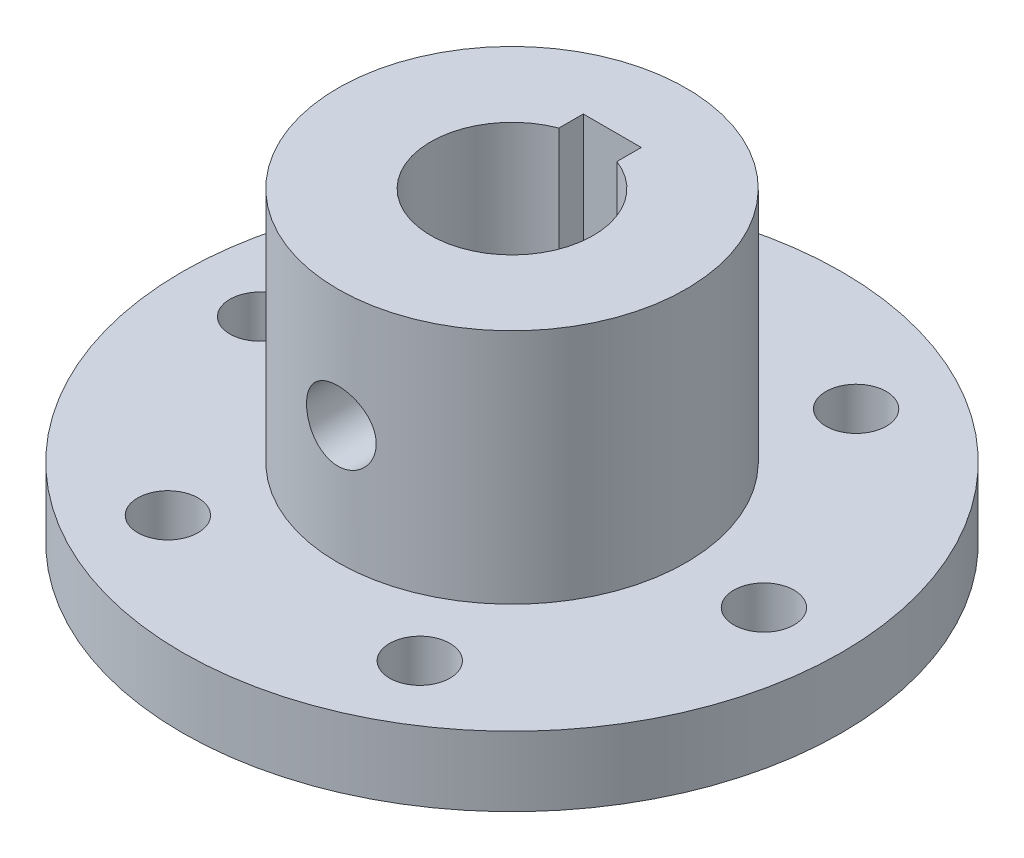
ISO-10303-21;
HEADER;
FILE_DESCRIPTION(('STEP AP214'),'2;1');
FILE_NAME('part.step','',(''),(''),'','','');
FILE_SCHEMA(('AUTOMOTIVE_DESIGN { 1 0 10303 214 1 1 1 1 }'));
ENDSEC;
DATA;
#1=APPLICATION_CONTEXT('core data for automotive mechanical design processes');
#2=APPLICATION_PROTOCOL_DEFINITION('international standard','automotive_design',2000,#1);
#3=PRODUCT_CONTEXT('',#1,'mechanical');
#4=PRODUCT('Part','Part','',(#3));
#5=PRODUCT_RELATED_PRODUCT_CATEGORY('part','',(#4));
#6=PRODUCT_DEFINITION_FORMATION('','',#4);
#7=PRODUCT_DEFINITION_CONTEXT('part definition',#1,'design');
#8=PRODUCT_DEFINITION('design','',#6,#7);
#9=PRODUCT_DEFINITION_SHAPE('','',#8);
#10=(LENGTH_UNIT() NAMED_UNIT(*) SI_UNIT(.MILLI.,.METRE.));
#11=(NAMED_UNIT(*) PLANE_ANGLE_UNIT() SI_UNIT($,.RADIAN.));
#12=(NAMED_UNIT(*) SI_UNIT($,.STERADIAN.) SOLID_ANGLE_UNIT());
#13=UNCERTAINTY_MEASURE_WITH_UNIT(LENGTH_MEASURE(1.E-05),#10,'distance_accuracy_value','');
#14=(GEOMETRIC_REPRESENTATION_CONTEXT(3) GLOBAL_UNCERTAINTY_ASSIGNED_CONTEXT((#13)) GLOBAL_UNIT_ASSIGNED_CONTEXT((#10,
#11,#12)) REPRESENTATION_CONTEXT('',''));
#15=CARTESIAN_POINT('',(0.,0.,0.));
#16=DIRECTION('',(0.,0.,1.));
#17=DIRECTION('',(1.,0.,0.));
#18=AXIS2_PLACEMENT_3D('',#15,#16,#17);
#19=CARTESIAN_POINT('',(0.,26.4,0.));
#20=DIRECTION('',(0.,-1.,0.));
#21=DIRECTION('',(0.,0.,-1.));
#22=AXIS2_PLACEMENT_3D('',#19,#20,#21);
#23=CYLINDRICAL_SURFACE('',#22,15.);
#24=CARTESIAN_POINT('',(0.,26.4,0.));
#25=DIRECTION('',(0.,1.,0.));
#26=DIRECTION('',(0.,0.,1.));
#27=AXIS2_PLACEMENT_3D('',#24,#25,#26);
#28=CIRCLE('',#27,15.);
#29=CARTESIAN_POINT('',(0.,26.4,15.));
#30=VERTEX_POINT('',#29);
#31=EDGE_CURVE('E145',#30,#30,#28,.T.);
#32=ORIENTED_EDGE('',*,*,#31,.F.);
#33=EDGE_LOOP('',(#32));
#34=FACE_BOUND('',#33,.T.);
#35=CARTESIAN_POINT('',(0.,6.,0.));
#36=DIRECTION('',(0.,1.,0.));
#37=DIRECTION('',(0.,0.,1.));
#38=AXIS2_PLACEMENT_3D('',#35,#36,#37);
#39=CIRCLE('',#38,15.);
#40=CARTESIAN_POINT('',(0.,6.,15.));
#41=VERTEX_POINT('',#40);
#42=EDGE_CURVE('E12',#41,#41,#39,.T.);
#43=ORIENTED_EDGE('',*,*,#42,.T.);
#44=EDGE_LOOP('',(#43));
#45=FACE_BOUND('',#44,.T.);
#46=CARTESIAN_POINT('',(-3.,16.2,14.6969384566991));
#47=CARTESIAN_POINT('',(-2.99999383762581,16.0333068735265,14.6969417707994));
#48=CARTESIAN_POINT('',(-2.98605951515443,15.86653613,14.6998052480611));
#49=CARTESIAN_POINT('',(-2.93073685074852,15.5377124845706,14.7109329391462));
#50=CARTESIAN_POINT('',(-2.88932654121148,15.3756634660921,14.7192014743436));
#51=CARTESIAN_POINT('',(-2.78038734785924,15.0610880899374,14.7401662116556));
#52=CARTESIAN_POINT('',(-2.71288444245786,14.9085524354022,14.7528580086323));
#53=CARTESIAN_POINT('',(-2.55374732301151,14.6169754659091,14.7812339844198));
#54=CARTESIAN_POINT('',(-2.46211445580345,14.4779333983863,14.7969179962038));
#55=CARTESIAN_POINT('',(-2.25593722696031,14.2153169884384,14.8297589908276));
#56=CARTESIAN_POINT('',(-2.14111696773995,14.0919612363481,14.8469321351174));
#57=CARTESIAN_POINT('',(-1.89242036706393,13.8661273992631,14.880674169078));
#58=CARTESIAN_POINT('',(-1.75854269093395,13.7636507777484,14.8972430163249));
#59=CARTESIAN_POINT('',(-1.47408406777277,13.5816359471146,14.9280838925269));
#60=CARTESIAN_POINT('',(-1.32336770301663,13.5023054585501,14.9423346432465));
#61=CARTESIAN_POINT('',(-1.01041245116181,13.3701751888556,14.9667521065089));
#62=CARTESIAN_POINT('',(-0.848174644261657,13.317372924297,14.9769192013236));
#63=CARTESIAN_POINT('',(-0.519050319835482,13.2404784191411,14.9919096206526));
#64=CARTESIAN_POINT('',(-0.352253217644441,13.216017067287,14.9968015886438));
#65=CARTESIAN_POINT('',(-0.0168557053126079,13.1953471444851,15.0009276355081));
#66=CARTESIAN_POINT('',(0.15174452949553,13.1991358510625,15.0001622595828));
#67=CARTESIAN_POINT('',(0.483426002230767,13.2345785406467,14.9931130460555));
#68=CARTESIAN_POINT('',(0.646551642895411,13.2658349315035,14.9869079509751));
#69=CARTESIAN_POINT('',(0.965194879740904,13.3546950973767,14.9697653147823));
#70=CARTESIAN_POINT('',(1.12071217124139,13.4122999265756,14.9588275843212));
#71=CARTESIAN_POINT('',(1.42085838960266,13.5525901204418,14.9333188805988));
#72=CARTESIAN_POINT('',(1.5654125224017,13.6354312533147,14.9187254452567));
#73=CARTESIAN_POINT('',(1.83871513757927,13.8237272317098,14.8875140842136));
#74=CARTESIAN_POINT('',(1.967461798575,13.9291846793115,14.8708959256567));
#75=CARTESIAN_POINT('',(2.20785429316037,14.1619008663254,14.8371289309338));
#76=CARTESIAN_POINT('',(2.31916294972089,14.2895075601888,14.8199758937255));
#77=CARTESIAN_POINT('',(2.51885547953042,14.5617493273523,14.7873471479628));
#78=CARTESIAN_POINT('',(2.60723891918325,14.7063847226496,14.7718714711364));
#79=CARTESIAN_POINT('',(2.75868844440565,15.0090624954654,14.7443414241877));
#80=CARTESIAN_POINT('',(2.82169994333313,15.167132902919,14.7322944469065));
#81=CARTESIAN_POINT('',(2.92017102488275,15.491913971172,14.7130942896382));
#82=CARTESIAN_POINT('',(2.95563419836993,15.6586235028573,14.7059404718528));
#83=CARTESIAN_POINT('',(2.99749801810815,15.9928945739971,14.6974643780348));
#84=CARTESIAN_POINT('',(3.00438557669374,16.160392722931,14.6960444117146));
#85=CARTESIAN_POINT('',(2.99021288493222,16.494144669599,14.6989345706656));
#86=CARTESIAN_POINT('',(2.96915421936733,16.6603985373566,14.7032443710116));
#87=CARTESIAN_POINT('',(2.90010662422247,16.9853059208767,14.7170169748474));
#88=CARTESIAN_POINT('',(2.8523778625179,17.1440170291073,14.7264299704349));
#89=CARTESIAN_POINT('',(2.73162310592555,17.4511898370862,14.7493046805499));
#90=CARTESIAN_POINT('',(2.65859502711953,17.5996506913072,14.7627667285881));
#91=CARTESIAN_POINT('',(2.48821242664679,17.8842393298505,14.7924421788612));
#92=CARTESIAN_POINT('',(2.39055323394826,18.0201811389025,14.8086891559471));
#93=CARTESIAN_POINT('',(2.17408671663814,18.2739249360027,14.8420117147991));
#94=CARTESIAN_POINT('',(2.05527721543361,18.3917250547478,14.8590873817145));
#95=CARTESIAN_POINT('',(1.79769682049367,18.6076876775567,14.8924603760765));
#96=CARTESIAN_POINT('',(1.65864749678889,18.70552096395,14.9087417312605));
#97=CARTESIAN_POINT('',(1.36580368990427,18.8764376444988,14.9384138288586));
#98=CARTESIAN_POINT('',(1.21200982630052,18.9495220780343,14.9518046926563));
#99=CARTESIAN_POINT('',(0.894908042472041,19.0683866152399,14.974118821832));
#100=CARTESIAN_POINT('',(0.731660020434237,19.1143215546788,14.9830673742781));
#101=CARTESIAN_POINT('',(0.399568364039736,19.1780737429915,14.9955970781298));
#102=CARTESIAN_POINT('',(0.230725406133636,19.195894378427,14.9991788759955));
#103=CARTESIAN_POINT('',(-0.104618681710863,19.2027809428887,15.0005562136234));
#104=CARTESIAN_POINT('',(-0.271109436424482,19.1923418413687,14.9984513564799));
#105=CARTESIAN_POINT('',(-0.599913093946949,19.1440981483565,14.9889013068102));
#106=CARTESIAN_POINT('',(-0.762226049261166,19.1062939009556,14.9814561814329));
#107=CARTESIAN_POINT('',(-1.07775824923519,19.0046130237252,14.9620649509476));
#108=CARTESIAN_POINT('',(-1.23099732972049,18.9407958656071,14.9501291174284));
#109=CARTESIAN_POINT('',(-1.52466366055821,18.7889632760067,14.9230416637104));
#110=CARTESIAN_POINT('',(-1.66508989730354,18.7009459322865,14.9078897894096));
#111=CARTESIAN_POINT('',(-1.93159167031775,18.5015418388161,14.8757279747022));
#112=CARTESIAN_POINT('',(-2.05739914834453,18.3898009908487,14.858692002537));
#113=CARTESIAN_POINT('',(-2.28864785327552,18.1468492797037,14.8248366872359));
#114=CARTESIAN_POINT('',(-2.39408424962674,18.0156338115602,14.8080173963616));
#115=CARTESIAN_POINT('',(-2.58267665834994,17.7357620499287,14.7763002820179));
#116=CARTESIAN_POINT('',(-2.66558044385427,17.5869331166362,14.7614251071368));
#117=CARTESIAN_POINT('',(-2.80507214779868,17.2772016802197,14.7355571137924));
#118=CARTESIAN_POINT('',(-2.86168393792249,17.1163102839384,14.7245607757495));
#119=CARTESIAN_POINT('',(-2.93600741957297,16.8292126336714,14.7098904341354));
#120=CARTESIAN_POINT('',(-2.95996169557105,16.7046437414581,14.7050635474382));
#121=CARTESIAN_POINT('',(-2.99196005387913,16.4533981363466,14.6985863537725));
#122=CARTESIAN_POINT('',(-3.00000468468793,16.3267214962666,14.6969359372925));
#123=CARTESIAN_POINT('',(-3.,16.2,14.6969384566991));
#124=B_SPLINE_CURVE_WITH_KNOTS('',3,(#46,#47,#48,#49,#50,#51,#52,#53,#54,#55,#56,#57,#58,#59,
#60,#61,#62,#63,#64,#65,#66,#67,#68,#69,#70,#71,#72,#73,#74,#75,#76,#77,#78,#79,#80,#81,#82,#83,
#84,#85,#86,#87,#88,#89,#90,#91,#92,#93,#94,#95,#96,#97,#98,#99,#100,#101,#102,#103,#104,#105,
#106,#107,#108,#109,#110,#111,#112,#113,#114,#115,#116,#117,#118,#119,#120,#121,#122,#123),
.UNSPECIFIED.,.T.,.F.,(4,2,2,2,2,2,2,2,2,2,2,2,2,2,2,2,2,2,2,2,2,2,2,2,2,2,2,2,2,2,2,2,2,2,2,2,
2,2,4),(0.,0.499615391608283,0.999630717852891,1.49914949382176,1.99864039457959,
2.50446757645311,3.01033020106266,3.52060201312351,4.03082604739679,4.53432746649241,
5.03778036348745,5.53406368900613,6.03036687221251,6.5297977266691,7.02928607310198,
7.5374804028745,8.04568434368161,8.5549758951833,9.06420105048074,9.5647127341378,
10.0651960358526,10.5608802534996,11.056605310632,11.5587917932356,12.0610299861063,
12.5709780520035,13.0809046989031,13.5878944073595,14.0948230407488,14.5929305224406,
15.0910317410027,15.5880005122636,16.0850085640405,16.5900345607679,17.0951801666934,
17.6057669573882,18.1158892527059,18.4957141091448,18.8755258705644),.UNSPECIFIED.);
#125=CARTESIAN_POINT('',(-3.,16.2,14.6969384566991));
#126=VERTEX_POINT('',#125);
#127=EDGE_CURVE('E129',#126,#126,#124,.T.);
#128=ORIENTED_EDGE('',*,*,#127,.F.);
#129=EDGE_LOOP('',(#128));
#130=FACE_BOUND('',#129,.T.);
#131=ADVANCED_FACE('F56',(#34,#45,#130),#23,.T.);
#132=CARTESIAN_POINT('',(0.,0.,0.));
#133=DIRECTION('',(0.,1.,0.));
#134=DIRECTION('',(0.,0.,1.));
#135=AXIS2_PLACEMENT_3D('',#132,#133,#134);
#136=CYLINDRICAL_SURFACE('',#135,7.);
#137=CARTESIAN_POINT('',(0.,26.4,0.));
#138=DIRECTION('',(0.,1.,0.));
#139=DIRECTION('',(0.,0.,1.));
#140=AXIS2_PLACEMENT_3D('',#137,#138,#139);
#141=CIRCLE('',#140,7.);
#142=CARTESIAN_POINT('',(-2.5,26.4,-6.53834841531101));
#143=VERTEX_POINT('',#142);
#144=CARTESIAN_POINT('',(2.5,26.4,-6.53834841531101));
#145=VERTEX_POINT('',#144);
#146=EDGE_CURVE('E139',#143,#145,#141,.T.);
#147=ORIENTED_EDGE('',*,*,#146,.T.);
#148=DIRECTION('',(0.,1.,0.));
#149=VECTOR('',#148,1.);
#150=CARTESIAN_POINT('',(2.5,0.,-6.53834841531101));
#151=LINE('',#150,#149);
#152=CARTESIAN_POINT('',(2.5,0.,-6.53834841531101));
#153=VERTEX_POINT('',#152);
#154=EDGE_CURVE('E111',#153,#145,#151,.T.);
#155=ORIENTED_EDGE('',*,*,#154,.F.);
#156=CARTESIAN_POINT('',(0.,0.,0.));
#157=DIRECTION('',(0.,1.,0.));
#158=DIRECTION('',(0.,0.,1.));
#159=AXIS2_PLACEMENT_3D('',#156,#157,#158);
#160=CIRCLE('',#159,7.);
#161=CARTESIAN_POINT('',(-2.5,0.,-6.53834841531101));
#162=VERTEX_POINT('',#161);
#163=EDGE_CURVE('E115',#162,#153,#160,.T.);
#164=ORIENTED_EDGE('',*,*,#163,.F.);
#165=DIRECTION('',(0.,1.,0.));
#166=VECTOR('',#165,1.);
#167=CARTESIAN_POINT('',(-2.5,0.,-6.53834841531101));
#168=LINE('',#167,#166);
#169=EDGE_CURVE('E102',#162,#143,#168,.T.);
#170=ORIENTED_EDGE('',*,*,#169,.T.);
#171=EDGE_LOOP('',(#147,#155,#164,#170));
#172=FACE_BOUND('',#171,.T.);
#173=CARTESIAN_POINT('',(-3.,16.2,6.32455532033676));
#174=CARTESIAN_POINT('',(-2.99999904512121,16.2798007630309,6.32455623917925));
#175=CARTESIAN_POINT('',(-2.99680914186365,16.3596308199706,6.32607259589376));
#176=CARTESIAN_POINT('',(-2.98409481890062,16.5186868909548,6.33207844610818));
#177=CARTESIAN_POINT('',(-2.97456636476115,16.5979124877601,6.33656983318198));
#178=CARTESIAN_POINT('',(-2.93654933365817,16.8340890265433,6.35433138320313));
#179=CARTESIAN_POINT('',(-2.8986294210123,16.9893199658572,6.3718883479981));
#180=CARTESIAN_POINT('',(-2.79949691759116,17.2898703155986,6.41604959211165));
#181=CARTESIAN_POINT('',(-2.73838302089272,17.4352286875862,6.44261548670749));
#182=CARTESIAN_POINT('',(-2.59488993442856,17.7136255439977,6.50173461776113));
#183=CARTESIAN_POINT('',(-2.51251491871712,17.8466664396721,6.53428667863442));
#184=CARTESIAN_POINT('',(-2.32303426891366,18.1054528395042,6.604111083221));
#185=CARTESIAN_POINT('',(-2.21474428773221,18.2302862690513,6.64154929418065));
#186=CARTESIAN_POINT('',(-1.97899162523151,18.4607018570591,6.71556787556132));
#187=CARTESIAN_POINT('',(-1.85152133453084,18.5662763379976,6.75214789882674));
#188=CARTESIAN_POINT('',(-1.5737748906695,18.7599192404586,6.82236442416004));
#189=CARTESIAN_POINT('',(-1.42271545416052,18.8469492520773,6.85578586283844));
#190=CARTESIAN_POINT('',(-1.10640716164425,18.9939641666446,6.91387422205065));
#191=CARTESIAN_POINT('',(-0.941164994307308,19.0539617357451,6.93854524147057));
#192=CARTESIAN_POINT('',(-0.61076426205199,19.141865036361,6.97517471062289));
#193=CARTESIAN_POINT('',(-0.446095117735238,19.1713460690391,6.98775448299434));
#194=CARTESIAN_POINT('',(-0.113699399968671,19.2024826967171,7.00104925914407));
#195=CARTESIAN_POINT('',(0.0540258257506347,19.204150273699,7.00176937203861));
#196=CARTESIAN_POINT('',(0.376268415183324,19.1804097522089,6.99162033228837));
#197=CARTESIAN_POINT('',(0.530941438169344,19.1567362003163,6.98149359551672));
#198=CARTESIAN_POINT('',(0.833871717827572,19.0859759310798,6.95182205628876));
#199=CARTESIAN_POINT('',(0.982128499493934,19.0388874835014,6.93227655784003));
#200=CARTESIAN_POINT('',(1.27075797068383,18.9220934103473,6.88526693329208));
#201=CARTESIAN_POINT('',(1.41097529460903,18.8520527076709,6.85768620781763));
#202=CARTESIAN_POINT('',(1.67803533028446,18.6916826446237,6.79727675004242));
#203=CARTESIAN_POINT('',(1.8048732130277,18.6013459954593,6.76444613359548));
#204=CARTESIAN_POINT('',(2.05154784007322,18.395190493324,6.69393790301249));
#205=CARTESIAN_POINT('',(2.1701729768624,18.277981130226,6.65608139107459));
#206=CARTESIAN_POINT('',(2.38662617777592,18.0252971683505,6.5815763134261));
#207=CARTESIAN_POINT('',(2.48444526456873,17.8898147261933,6.5449282748833));
#208=CARTESIAN_POINT('',(2.65987942757701,17.5982201255285,6.47566835431168));
#209=CARTESIAN_POINT('',(2.73662769389097,17.4415358545187,6.44325238173047));
#210=CARTESIAN_POINT('',(2.86214771894642,17.1157109916567,6.3884939447888));
#211=CARTESIAN_POINT('',(2.9109408263676,16.946580016742,6.36614379619967));
#212=CARTESIAN_POINT('',(2.9759867011968,16.6128272043879,6.33598550498636));
#213=CARTESIAN_POINT('',(2.99421280080632,16.4486710193927,6.32729797712828));
#214=CARTESIAN_POINT('',(3.00343131976712,16.1194510248917,6.32292988606605));
#215=CARTESIAN_POINT('',(2.99443410914468,15.9543875848925,6.32724437007431));
#216=CARTESIAN_POINT('',(2.9512647841786,15.6401374262566,6.34748143158175));
#217=CARTESIAN_POINT('',(2.9188846108295,15.4906442596282,6.36257694871081));
#218=CARTESIAN_POINT('',(2.83228012727602,15.1993545236303,6.40159573000742));
#219=CARTESIAN_POINT('',(2.77805051059372,15.0575598334555,6.42552113853308));
#220=CARTESIAN_POINT('',(2.64668378105435,14.7787901097089,6.48076667248579));
#221=CARTESIAN_POINT('',(2.5686531941561,14.642292678178,6.51236308247384));
#222=CARTESIAN_POINT('',(2.39277124314047,14.3836492944887,6.57901833984006));
#223=CARTESIAN_POINT('',(2.29491096228641,14.2615098378019,6.61407874120977));
#224=CARTESIAN_POINT('',(2.07211495440809,14.0239710744273,6.68739396565838));
#225=CARTESIAN_POINT('',(1.94556360485738,13.9100847627762,6.72566111015056));
#226=CARTESIAN_POINT('',(1.67428466903032,13.7048657627252,6.79826947497518));
#227=CARTESIAN_POINT('',(1.5295552644811,13.6135353332079,6.83261030191759));
#228=CARTESIAN_POINT('',(1.2245807874168,13.4559173101929,6.89381439172467));
#229=CARTESIAN_POINT('',(1.06426298143306,13.3897549537128,6.92064008929576));
#230=CARTESIAN_POINT('',(0.733319762769439,13.2858502018438,6.96347660484597));
#231=CARTESIAN_POINT('',(0.562700954301776,13.2480898019916,6.9794942735468));
#232=CARTESIAN_POINT('',(0.229480384595672,13.2044225398434,6.99808081286415));
#233=CARTESIAN_POINT('',(0.0672060876467166,13.1963861794806,7.00154837158207));
#234=CARTESIAN_POINT('',(-0.256339620951761,13.2065955187403,6.99717401704727));
#235=CARTESIAN_POINT('',(-0.417611220908518,13.224836124004,6.98933429595527));
#236=CARTESIAN_POINT('',(-0.728044798339691,13.2855535041725,6.96371224258032));
#237=CARTESIAN_POINT('',(-0.877433690400416,13.3270538473655,6.9463310265813));
#238=CARTESIAN_POINT('',(-1.16704890744753,13.4320161839198,6.90358200259661));
#239=CARTESIAN_POINT('',(-1.30727354037359,13.4954822194157,6.87821272472253));
#240=CARTESIAN_POINT('',(-1.58164154030708,13.645789887836,6.82048100144583));
#241=CARTESIAN_POINT('',(-1.71521554911027,13.7335659218535,6.78785230171247));
#242=CARTESIAN_POINT('',(-1.96631980223031,13.9286817135381,6.71941601876114));
#243=CARTESIAN_POINT('',(-2.08384366642575,14.0360292117295,6.68360718068102));
#244=CARTESIAN_POINT('',(-2.30839582375668,14.2763838634431,6.60956029826528));
#245=CARTESIAN_POINT('',(-2.41404185093547,14.410688414619,6.57133471854879));
#246=CARTESIAN_POINT('',(-2.60157161791913,14.6963461327278,6.49938146624856));
#247=CARTESIAN_POINT('',(-2.68344152863089,14.8477091507598,6.46565641748318));
#248=CARTESIAN_POINT('',(-2.78618250414778,15.0843824410763,6.42172587804179));
#249=CARTESIAN_POINT('',(-2.81707998873811,15.164855759159,6.40819457191417));
#250=CARTESIAN_POINT('',(-2.87192428390112,15.3285162228321,6.38380411418013));
#251=CARTESIAN_POINT('',(-2.89587453038153,15.4117020041912,6.37294364206054));
#252=CARTESIAN_POINT('',(-2.93649221837599,15.5799308076813,6.35433014729515));
#253=CARTESIAN_POINT('',(-2.95317884271359,15.664968307382,6.3465689441917));
#254=CARTESIAN_POINT('',(-2.97913893233313,15.8363627717128,6.33442493706763));
#255=CARTESIAN_POINT('',(-2.9884180785096,15.9227186733412,6.33003954418514));
#256=CARTESIAN_POINT('',(-2.99595579124565,16.0410614001764,6.32647229512562));
#257=CARTESIAN_POINT('',(-2.99747183035651,16.0728242807599,6.32575401974705));
#258=CARTESIAN_POINT('',(-2.99949413311609,16.1363898891686,6.3247953454093));
#259=CARTESIAN_POINT('',(-3.00000038060031,16.1681926176233,6.32455495409998));
#260=CARTESIAN_POINT('',(-3.,16.2,6.32455532033676));
#261=B_SPLINE_CURVE_WITH_KNOTS('',3,(#173,#174,#175,#176,#177,#178,#179,#180,#181,#182,#183,
#184,#185,#186,#187,#188,#189,#190,#191,#192,#193,#194,#195,#196,#197,#198,#199,#200,#201,#202,
#203,#204,#205,#206,#207,#208,#209,#210,#211,#212,#213,#214,#215,#216,#217,#218,#219,#220,#221,
#222,#223,#224,#225,#226,#227,#228,#229,#230,#231,#232,#233,#234,#235,#236,#237,#238,#239,#240,
#241,#242,#243,#244,#245,#246,#247,#248,#249,#250,#251,#252,#253,#254,#255,#256,#257,#258,#259,
#260),.UNSPECIFIED.,.T.,.F.,(4,2,2,2,2,2,2,2,2,2,2,2,2,2,2,2,2,2,2,2,2,2,2,2,2,2,2,2,2,2,2,2,2,
2,2,2,2,2,2,2,2,2,2,4),(0.,0.239366653231037,0.478885807272612,0.958574399125931,
1.43624431857918,1.91382053150697,2.41995684393642,2.92629448725105,3.45610451675015,
3.98566604296333,4.48627308722846,4.98666446539179,5.45487182502104,5.92311378779297,
6.39852111765621,6.8740994521391,7.38485137094337,7.89582322238326,8.42542768080316,
8.95462715213609,9.44812252419892,9.94142993544506,10.4004743903489,10.8596303986217,
11.3387499488479,11.8180854227975,12.3391595177845,12.8602857751477,13.3839722669446,
13.9073265049035,14.3923682623503,14.8773159966024,15.3432850585276,15.8093399138768,
16.2966585998759,16.784170440423,17.3070906286303,17.8303143607246,18.0917878499581,
18.3531318004373,18.6137813055803,18.8742307225593,18.9696371385413,19.0650450817536),.UNSPECIFIED.);
#262=CARTESIAN_POINT('',(-3.,16.2,6.32455532033676));
#263=VERTEX_POINT('',#262);
#264=EDGE_CURVE('E60',#263,#263,#261,.T.);
#265=ORIENTED_EDGE('',*,*,#264,.F.);
#266=EDGE_LOOP('',(#265));
#267=FACE_BOUND('',#266,.T.);
#268=ADVANCED_FACE('F116',(#172,#267),#136,.F.);
#269=CARTESIAN_POINT('',(0.,6.,0.));
#270=DIRECTION('',(0.,-1.,0.));
#271=DIRECTION('',(0.,0.,-1.));
#272=AXIS2_PLACEMENT_3D('',#269,#270,#271);
#273=CYLINDRICAL_SURFACE('',#272,28.4);
#274=CARTESIAN_POINT('',(0.,6.,0.));
#275=DIRECTION('',(0.,1.,0.));
#276=DIRECTION('',(0.,0.,1.));
#277=AXIS2_PLACEMENT_3D('',#274,#275,#276);
#278=CIRCLE('',#277,28.4);
#279=CARTESIAN_POINT('',(0.,6.,28.4));
#280=VERTEX_POINT('',#279);
#281=EDGE_CURVE('E70',#280,#280,#278,.T.);
#282=ORIENTED_EDGE('',*,*,#281,.F.);
#283=EDGE_LOOP('',(#282));
#284=FACE_BOUND('',#283,.T.);
#285=CARTESIAN_POINT('',(0.,0.,0.));
#286=DIRECTION('',(0.,1.,0.));
#287=DIRECTION('',(0.,0.,1.));
#288=AXIS2_PLACEMENT_3D('',#285,#286,#287);
#289=CIRCLE('',#288,28.4);
#290=CARTESIAN_POINT('',(0.,0.,28.4));
#291=VERTEX_POINT('',#290);
#292=EDGE_CURVE('E150',#291,#291,#289,.T.);
#293=ORIENTED_EDGE('',*,*,#292,.T.);
#294=EDGE_LOOP('',(#293));
#295=FACE_BOUND('',#294,.T.);
#296=ADVANCED_FACE('F58',(#284,#295),#273,.T.);
#297=CARTESIAN_POINT('',(0.,6.,0.));
#298=DIRECTION('',(0.,1.,0.));
#299=DIRECTION('',(0.,0.,1.));
#300=AXIS2_PLACEMENT_3D('',#297,#298,#299);
#301=PLANE('',#300);
#302=CARTESIAN_POINT('',(-10.8500000000002,6.,-18.7927512621222));
#303=DIRECTION('',(0.,1.,0.));
#304=DIRECTION('',(-0.866025403784433,0.,0.50000000000001));
#305=AXIS2_PLACEMENT_3D('',#302,#303,#304);
#306=CIRCLE('',#305,2.6);
#307=CARTESIAN_POINT('',(-13.1016660498397,6.,-17.4927512621222));
#308=VERTEX_POINT('',#307);
#309=EDGE_CURVE('E276',#308,#308,#306,.T.);
#310=ORIENTED_EDGE('',*,*,#309,.F.);
#311=EDGE_LOOP('',(#310));
#312=FACE_BOUND('',#311,.T.);
#313=CARTESIAN_POINT('',(10.8499999999998,6.,-18.7927512621224));
#314=DIRECTION('',(0.,1.,0.));
#315=DIRECTION('',(-0.866025403784443,0.,-0.499999999999992));
#316=AXIS2_PLACEMENT_3D('',#313,#314,#315);
#317=CIRCLE('',#316,2.6);
#318=CARTESIAN_POINT('',(8.59833395016027,6.,-20.0927512621224));
#319=VERTEX_POINT('',#318);
#320=EDGE_CURVE('E272',#319,#319,#317,.T.);
#321=ORIENTED_EDGE('',*,*,#320,.F.);
#322=EDGE_LOOP('',(#321));
#323=FACE_BOUND('',#322,.T.);
#324=CARTESIAN_POINT('',(21.7,6.,0.));
#325=DIRECTION('',(0.,1.,0.));
#326=DIRECTION('',(0.,0.,-1.));
#327=AXIS2_PLACEMENT_3D('',#324,#325,#326);
#328=CIRCLE('',#327,2.6);
#329=CARTESIAN_POINT('',(21.7,6.,-2.6));
#330=VERTEX_POINT('',#329);
#331=EDGE_CURVE('E264',#330,#330,#328,.T.);
#332=ORIENTED_EDGE('',*,*,#331,.F.);
#333=EDGE_LOOP('',(#332));
#334=FACE_BOUND('',#333,.T.);
#335=CARTESIAN_POINT('',(10.8500000000001,6.,18.7927512621223));
#336=DIRECTION('',(0.,1.,0.));
#337=DIRECTION('',(0.866025403784436,0.,-0.500000000000004));
#338=AXIS2_PLACEMENT_3D('',#335,#336,#337);
#339=CIRCLE('',#338,2.6);
#340=CARTESIAN_POINT('',(13.1016660498396,6.,17.4927512621223));
#341=VERTEX_POINT('',#340);
#342=EDGE_CURVE('E258',#341,#341,#339,.T.);
#343=ORIENTED_EDGE('',*,*,#342,.F.);
#344=EDGE_LOOP('',(#343));
#345=FACE_BOUND('',#344,.T.);
#346=CARTESIAN_POINT('',(-10.85,6.,18.7927512621223));
#347=DIRECTION('',(0.,1.,0.));
#348=DIRECTION('',(0.86602540378444,0.,0.499999999999998));
#349=AXIS2_PLACEMENT_3D('',#346,#347,#348);
#350=CIRCLE('',#349,2.6);
#351=CARTESIAN_POINT('',(-8.59833395016041,6.,20.0927512621223));
#352=VERTEX_POINT('',#351);
#353=EDGE_CURVE('E157',#352,#352,#350,.T.);
#354=ORIENTED_EDGE('',*,*,#353,.F.);
#355=EDGE_LOOP('',(#354));
#356=FACE_BOUND('',#355,.T.);
#357=CARTESIAN_POINT('',(-21.7,6.,0.));
#358=DIRECTION('',(0.,1.,0.));
#359=DIRECTION('',(0.,0.,1.));
#360=AXIS2_PLACEMENT_3D('',#357,#358,#359);
#361=CIRCLE('',#360,2.6);
#362=CARTESIAN_POINT('',(-21.7,6.,2.6));
#363=VERTEX_POINT('',#362);
#364=EDGE_CURVE('E168',#363,#363,#361,.T.);
#365=ORIENTED_EDGE('',*,*,#364,.F.);
#366=EDGE_LOOP('',(#365));
#367=FACE_BOUND('',#366,.T.);
#368=ORIENTED_EDGE('',*,*,#42,.F.);
#369=EDGE_LOOP('',(#368));
#370=FACE_BOUND('',#369,.T.);
#371=ORIENTED_EDGE('',*,*,#281,.T.);
#372=EDGE_LOOP('',(#371));
#373=FACE_BOUND('',#372,.T.);
#374=ADVANCED_FACE('F185',(#312,#323,#334,#345,#356,#367,#370,#373),#301,.T.);
#375=CARTESIAN_POINT('',(0.,0.,0.));
#376=DIRECTION('',(0.,1.,0.));
#377=DIRECTION('',(0.,0.,1.));
#378=AXIS2_PLACEMENT_3D('',#375,#376,#377);
#379=PLANE('',#378);
#380=CARTESIAN_POINT('',(-10.8500000000002,0.,-18.7927512621222));
#381=DIRECTION('',(0.,1.,0.));
#382=DIRECTION('',(-0.866025403784433,0.,0.50000000000001));
#383=AXIS2_PLACEMENT_3D('',#380,#381,#382);
#384=CIRCLE('',#383,2.6);
#385=CARTESIAN_POINT('',(-13.1016660498397,0.,-17.4927512621222));
#386=VERTEX_POINT('',#385);
#387=EDGE_CURVE('E275',#386,#386,#384,.T.);
#388=ORIENTED_EDGE('',*,*,#387,.T.);
#389=EDGE_LOOP('',(#388));
#390=FACE_BOUND('',#389,.T.);
#391=CARTESIAN_POINT('',(10.8499999999998,0.,-18.7927512621224));
#392=DIRECTION('',(0.,1.,0.));
#393=DIRECTION('',(-0.866025403784443,0.,-0.499999999999992));
#394=AXIS2_PLACEMENT_3D('',#391,#392,#393);
#395=CIRCLE('',#394,2.6);
#396=CARTESIAN_POINT('',(8.59833395016027,0.,-20.0927512621224));
#397=VERTEX_POINT('',#396);
#398=EDGE_CURVE('E269',#397,#397,#395,.T.);
#399=ORIENTED_EDGE('',*,*,#398,.T.);
#400=EDGE_LOOP('',(#399));
#401=FACE_BOUND('',#400,.T.);
#402=CARTESIAN_POINT('',(21.7,0.,0.));
#403=DIRECTION('',(0.,1.,0.));
#404=DIRECTION('',(0.,0.,-1.));
#405=AXIS2_PLACEMENT_3D('',#402,#403,#404);
#406=CIRCLE('',#405,2.6);
#407=CARTESIAN_POINT('',(21.7,0.,-2.6));
#408=VERTEX_POINT('',#407);
#409=EDGE_CURVE('E260',#408,#408,#406,.T.);
#410=ORIENTED_EDGE('',*,*,#409,.T.);
#411=EDGE_LOOP('',(#410));
#412=FACE_BOUND('',#411,.T.);
#413=CARTESIAN_POINT('',(10.8500000000001,0.,18.7927512621223));
#414=DIRECTION('',(0.,1.,0.));
#415=DIRECTION('',(0.866025403784436,0.,-0.500000000000004));
#416=AXIS2_PLACEMENT_3D('',#413,#414,#415);
#417=CIRCLE('',#416,2.6);
#418=CARTESIAN_POINT('',(13.1016660498396,0.,17.4927512621223));
#419=VERTEX_POINT('',#418);
#420=EDGE_CURVE('E164',#419,#419,#417,.T.);
#421=ORIENTED_EDGE('',*,*,#420,.T.);
#422=EDGE_LOOP('',(#421));
#423=FACE_BOUND('',#422,.T.);
#424=CARTESIAN_POINT('',(-10.85,0.,18.7927512621223));
#425=DIRECTION('',(0.,1.,0.));
#426=DIRECTION('',(0.86602540378444,0.,0.499999999999998));
#427=AXIS2_PLACEMENT_3D('',#424,#425,#426);
#428=CIRCLE('',#427,2.6);
#429=CARTESIAN_POINT('',(-8.59833395016041,0.,20.0927512621223));
#430=VERTEX_POINT('',#429);
#431=EDGE_CURVE('E163',#430,#430,#428,.T.);
#432=ORIENTED_EDGE('',*,*,#431,.T.);
#433=EDGE_LOOP('',(#432));
#434=FACE_BOUND('',#433,.T.);
#435=CARTESIAN_POINT('',(-21.7,0.,0.));
#436=DIRECTION('',(0.,1.,0.));
#437=DIRECTION('',(0.,0.,1.));
#438=AXIS2_PLACEMENT_3D('',#435,#436,#437);
#439=CIRCLE('',#438,2.6);
#440=CARTESIAN_POINT('',(-21.7,0.,2.6));
#441=VERTEX_POINT('',#440);
#442=EDGE_CURVE('E166',#441,#441,#439,.T.);
#443=ORIENTED_EDGE('',*,*,#442,.T.);
#444=EDGE_LOOP('',(#443));
#445=FACE_BOUND('',#444,.T.);
#446=DIRECTION('',(-1.,0.,0.));
#447=VECTOR('',#446,1.);
#448=CARTESIAN_POINT('',(-2.5,0.,-8.63834841531101));
#449=LINE('',#448,#447);
#450=CARTESIAN_POINT('',(2.5,0.,-8.63834841531101));
#451=VERTEX_POINT('',#450);
#452=CARTESIAN_POINT('',(-2.5,0.,-8.63834841531101));
#453=VERTEX_POINT('',#452);
#454=EDGE_CURVE('E112',#451,#453,#449,.T.);
#455=ORIENTED_EDGE('',*,*,#454,.T.);
#456=DIRECTION('',(0.,0.,1.));
#457=VECTOR('',#456,1.);
#458=CARTESIAN_POINT('',(-2.5,0.,-8.63834841531101));
#459=LINE('',#458,#457);
#460=EDGE_CURVE('E106',#453,#162,#459,.T.);
#461=ORIENTED_EDGE('',*,*,#460,.T.);
#462=ORIENTED_EDGE('',*,*,#163,.T.);
#463=DIRECTION('',(0.,0.,-1.));
#464=VECTOR('',#463,1.);
#465=CARTESIAN_POINT('',(2.5,0.,-8.63834841531101));
#466=LINE('',#465,#464);
#467=EDGE_CURVE('E78',#153,#451,#466,.T.);
#468=ORIENTED_EDGE('',*,*,#467,.T.);
#469=EDGE_LOOP('',(#455,#461,#462,#468));
#470=FACE_BOUND('',#469,.T.);
#471=ORIENTED_EDGE('',*,*,#292,.F.);
#472=EDGE_LOOP('',(#471));
#473=FACE_BOUND('',#472,.T.);
#474=ADVANCED_FACE('F120',(#390,#401,#412,#423,#434,#445,#470,#473),#379,.F.);
#475=CARTESIAN_POINT('',(0.,26.4,0.));
#476=DIRECTION('',(0.,1.,0.));
#477=DIRECTION('',(0.,0.,1.));
#478=AXIS2_PLACEMENT_3D('',#475,#476,#477);
#479=PLANE('',#478);
#480=DIRECTION('',(0.,0.,1.));
#481=VECTOR('',#480,1.);
#482=CARTESIAN_POINT('',(-2.5,26.4,-8.63834841531101));
#483=LINE('',#482,#481);
#484=CARTESIAN_POINT('',(-2.5,26.4,-8.63834841531101));
#485=VERTEX_POINT('',#484);
#486=EDGE_CURVE('E86',#485,#143,#483,.T.);
#487=ORIENTED_EDGE('',*,*,#486,.F.);
#488=DIRECTION('',(-1.,0.,0.));
#489=VECTOR('',#488,1.);
#490=CARTESIAN_POINT('',(-2.5,26.4,-8.63834841531101));
#491=LINE('',#490,#489);
#492=CARTESIAN_POINT('',(2.5,26.4,-8.63834841531101));
#493=VERTEX_POINT('',#492);
#494=EDGE_CURVE('E123',#493,#485,#491,.T.);
#495=ORIENTED_EDGE('',*,*,#494,.F.);
#496=DIRECTION('',(0.,0.,-1.));
#497=VECTOR('',#496,1.);
#498=CARTESIAN_POINT('',(2.5,26.4,-8.63834841531101));
#499=LINE('',#498,#497);
#500=EDGE_CURVE('E126',#145,#493,#499,.T.);
#501=ORIENTED_EDGE('',*,*,#500,.F.);
#502=ORIENTED_EDGE('',*,*,#146,.F.);
#503=EDGE_LOOP('',(#487,#495,#501,#502));
#504=FACE_BOUND('',#503,.T.);
#505=ORIENTED_EDGE('',*,*,#31,.T.);
#506=EDGE_LOOP('',(#505));
#507=FACE_BOUND('',#506,.T.);
#508=ADVANCED_FACE('F203',(#504,#507),#479,.T.);
#509=CARTESIAN_POINT('',(-2.5,0.,-8.63834841531101));
#510=DIRECTION('',(-1.,0.,0.));
#511=DIRECTION('',(0.,0.,1.));
#512=AXIS2_PLACEMENT_3D('',#509,#510,#511);
#513=PLANE('',#512);
#514=ORIENTED_EDGE('',*,*,#486,.T.);
#515=ORIENTED_EDGE('',*,*,#169,.F.);
#516=ORIENTED_EDGE('',*,*,#460,.F.);
#517=DIRECTION('',(0.,1.,0.));
#518=VECTOR('',#517,1.);
#519=CARTESIAN_POINT('',(-2.5,0.,-8.63834841531101));
#520=LINE('',#519,#518);
#521=EDGE_CURVE('E143',#453,#485,#520,.T.);
#522=ORIENTED_EDGE('',*,*,#521,.T.);
#523=EDGE_LOOP('',(#514,#515,#516,#522));
#524=FACE_BOUND('',#523,.T.);
#525=ADVANCED_FACE('F104',(#524),#513,.F.);
#526=CARTESIAN_POINT('',(-2.5,0.,-8.63834841531101));
#527=DIRECTION('',(0.,0.,-1.));
#528=DIRECTION('',(-1.,0.,0.));
#529=AXIS2_PLACEMENT_3D('',#526,#527,#528);
#530=PLANE('',#529);
#531=ORIENTED_EDGE('',*,*,#494,.T.);
#532=ORIENTED_EDGE('',*,*,#521,.F.);
#533=ORIENTED_EDGE('',*,*,#454,.F.);
#534=DIRECTION('',(0.,1.,0.));
#535=VECTOR('',#534,1.);
#536=CARTESIAN_POINT('',(2.5,0.,-8.63834841531101));
#537=LINE('',#536,#535);
#538=EDGE_CURVE('E146',#451,#493,#537,.T.);
#539=ORIENTED_EDGE('',*,*,#538,.T.);
#540=EDGE_LOOP('',(#531,#532,#533,#539));
#541=FACE_BOUND('',#540,.T.);
#542=ADVANCED_FACE('F221',(#541),#530,.F.);
#543=CARTESIAN_POINT('',(2.5,0.,-8.63834841531101));
#544=DIRECTION('',(1.,0.,0.));
#545=DIRECTION('',(0.,0.,-1.));
#546=AXIS2_PLACEMENT_3D('',#543,#544,#545);
#547=PLANE('',#546);
#548=ORIENTED_EDGE('',*,*,#500,.T.);
#549=ORIENTED_EDGE('',*,*,#538,.F.);
#550=ORIENTED_EDGE('',*,*,#467,.F.);
#551=ORIENTED_EDGE('',*,*,#154,.T.);
#552=EDGE_LOOP('',(#548,#549,#550,#551));
#553=FACE_BOUND('',#552,.T.);
#554=ADVANCED_FACE('F224',(#553),#547,.F.);
#555=CARTESIAN_POINT('',(0.,16.2,28.4));
#556=DIRECTION('',(0.,0.,-1.));
#557=DIRECTION('',(-1.,0.,0.));
#558=AXIS2_PLACEMENT_3D('',#555,#556,#557);
#559=CYLINDRICAL_SURFACE('',#558,3.);
#560=ORIENTED_EDGE('',*,*,#264,.T.);
#561=EDGE_LOOP('',(#560));
#562=FACE_BOUND('',#561,.T.);
#563=ORIENTED_EDGE('',*,*,#127,.T.);
#564=EDGE_LOOP('',(#563));
#565=FACE_BOUND('',#564,.T.);
#566=ADVANCED_FACE('F227',(#562,#565),#559,.F.);
#567=CARTESIAN_POINT('',(-21.7,0.,0.));
#568=DIRECTION('',(0.,1.,0.));
#569=DIRECTION('',(0.,0.,1.));
#570=AXIS2_PLACEMENT_3D('',#567,#568,#569);
#571=CYLINDRICAL_SURFACE('',#570,2.6);
#572=ORIENTED_EDGE('',*,*,#442,.F.);
#573=EDGE_LOOP('',(#572));
#574=FACE_BOUND('',#573,.T.);
#575=ORIENTED_EDGE('',*,*,#364,.T.);
#576=EDGE_LOOP('',(#575));
#577=FACE_BOUND('',#576,.T.);
#578=ADVANCED_FACE('F181',(#574,#577),#571,.F.);
#579=CARTESIAN_POINT('',(-10.85,0.,18.7927512621223));
#580=DIRECTION('',(0.,1.,0.));
#581=DIRECTION('',(0.,0.,1.));
#582=AXIS2_PLACEMENT_3D('',#579,#580,#581);
#583=CYLINDRICAL_SURFACE('',#582,2.6);
#584=ORIENTED_EDGE('',*,*,#431,.F.);
#585=EDGE_LOOP('',(#584));
#586=FACE_BOUND('',#585,.T.);
#587=ORIENTED_EDGE('',*,*,#353,.T.);
#588=EDGE_LOOP('',(#587));
#589=FACE_BOUND('',#588,.T.);
#590=ADVANCED_FACE('F177',(#586,#589),#583,.F.);
#591=CARTESIAN_POINT('',(10.8500000000001,0.,18.7927512621223));
#592=DIRECTION('',(0.,1.,0.));
#593=DIRECTION('',(0.,0.,1.));
#594=AXIS2_PLACEMENT_3D('',#591,#592,#593);
#595=CYLINDRICAL_SURFACE('',#594,2.6);
#596=ORIENTED_EDGE('',*,*,#420,.F.);
#597=EDGE_LOOP('',(#596));
#598=FACE_BOUND('',#597,.T.);
#599=ORIENTED_EDGE('',*,*,#342,.T.);
#600=EDGE_LOOP('',(#599));
#601=FACE_BOUND('',#600,.T.);
#602=ADVANCED_FACE('F180',(#598,#601),#595,.F.);
#603=CARTESIAN_POINT('',(21.7,0.,0.));
#604=DIRECTION('',(0.,1.,0.));
#605=DIRECTION('',(0.,0.,1.));
#606=AXIS2_PLACEMENT_3D('',#603,#604,#605);
#607=CYLINDRICAL_SURFACE('',#606,2.6);
#608=ORIENTED_EDGE('',*,*,#409,.F.);
#609=EDGE_LOOP('',(#608));
#610=FACE_BOUND('',#609,.T.);
#611=ORIENTED_EDGE('',*,*,#331,.T.);
#612=EDGE_LOOP('',(#611));
#613=FACE_BOUND('',#612,.T.);
#614=ADVANCED_FACE('F244',(#610,#613),#607,.F.);
#615=CARTESIAN_POINT('',(10.8499999999998,0.,-18.7927512621224));
#616=DIRECTION('',(0.,1.,0.));
#617=DIRECTION('',(0.,0.,1.));
#618=AXIS2_PLACEMENT_3D('',#615,#616,#617);
#619=CYLINDRICAL_SURFACE('',#618,2.6);
#620=ORIENTED_EDGE('',*,*,#398,.F.);
#621=EDGE_LOOP('',(#620));
#622=FACE_BOUND('',#621,.T.);
#623=ORIENTED_EDGE('',*,*,#320,.T.);
#624=EDGE_LOOP('',(#623));
#625=FACE_BOUND('',#624,.T.);
#626=ADVANCED_FACE('F240',(#622,#625),#619,.F.);
#627=CARTESIAN_POINT('',(-10.8500000000002,0.,-18.7927512621222));
#628=DIRECTION('',(0.,1.,0.));
#629=DIRECTION('',(0.,0.,1.));
#630=AXIS2_PLACEMENT_3D('',#627,#628,#629);
#631=CYLINDRICAL_SURFACE('',#630,2.6);
#632=ORIENTED_EDGE('',*,*,#387,.F.);
#633=EDGE_LOOP('',(#632));
#634=FACE_BOUND('',#633,.T.);
#635=ORIENTED_EDGE('',*,*,#309,.T.);
#636=EDGE_LOOP('',(#635));
#637=FACE_BOUND('',#636,.T.);
#638=ADVANCED_FACE('F237',(#634,#637),#631,.F.);
#639=CLOSED_SHELL('',(#131,#268,#296,#374,#474,#508,#525,#542,#554,#566,#578,#590,#602,#614,
#626,#638));
#640=MANIFOLD_SOLID_BREP('B2',#639);
#641=ADVANCED_BREP_SHAPE_REPRESENTATION('',(#18,#640),#14);
#642=SHAPE_DEFINITION_REPRESENTATION(#9,#641);
ENDSEC;
END-ISO-10303-21;
